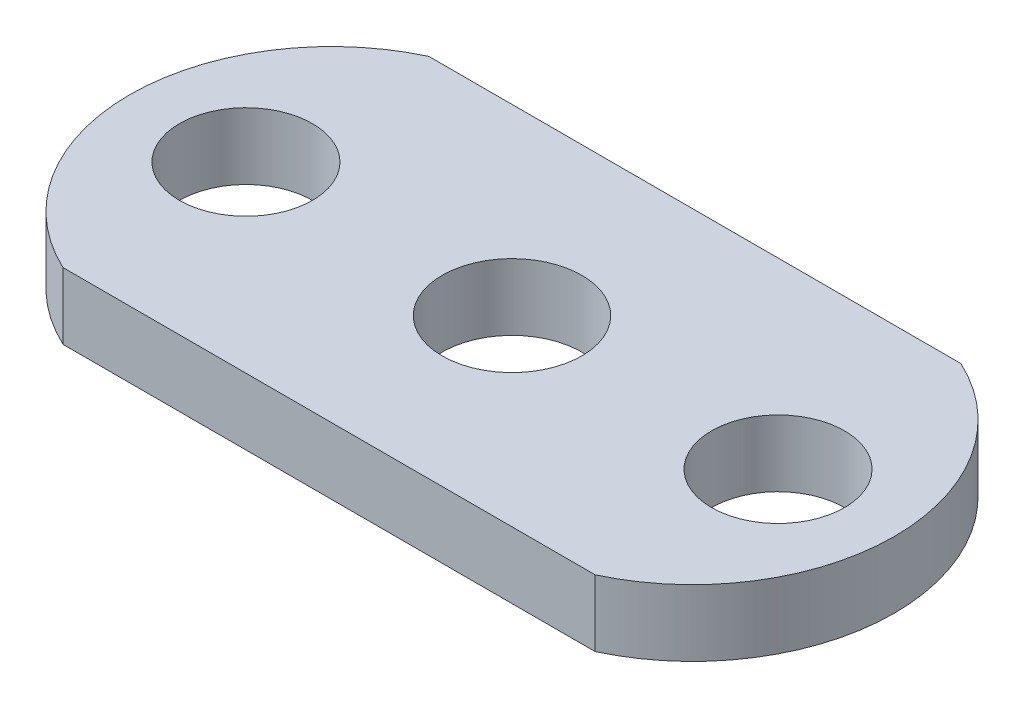
ISO-10303-21;
HEADER;
FILE_DESCRIPTION(('STEP AP214'),'2;1');
FILE_NAME('part.step','',(''),(''),'','','');
FILE_SCHEMA(('AUTOMOTIVE_DESIGN { 1 0 10303 214 1 1 1 1 }'));
ENDSEC;
DATA;
#1=APPLICATION_CONTEXT('core data for automotive mechanical design processes');
#2=APPLICATION_PROTOCOL_DEFINITION('international standard','automotive_design',2000,#1);
#3=PRODUCT_CONTEXT('',#1,'mechanical');
#4=PRODUCT('Part','Part','',(#3));
#5=PRODUCT_RELATED_PRODUCT_CATEGORY('part','',(#4));
#6=PRODUCT_DEFINITION_FORMATION('','',#4);
#7=PRODUCT_DEFINITION_CONTEXT('part definition',#1,'design');
#8=PRODUCT_DEFINITION('design','',#6,#7);
#9=PRODUCT_DEFINITION_SHAPE('','',#8);
#10=(LENGTH_UNIT() NAMED_UNIT(*) SI_UNIT(.MILLI.,.METRE.));
#11=(NAMED_UNIT(*) PLANE_ANGLE_UNIT() SI_UNIT($,.RADIAN.));
#12=(NAMED_UNIT(*) SI_UNIT($,.STERADIAN.) SOLID_ANGLE_UNIT());
#13=UNCERTAINTY_MEASURE_WITH_UNIT(LENGTH_MEASURE(1.E-05),#10,'distance_accuracy_value','');
#14=(GEOMETRIC_REPRESENTATION_CONTEXT(3) GLOBAL_UNCERTAINTY_ASSIGNED_CONTEXT((#13)) GLOBAL_UNIT_ASSIGNED_CONTEXT((#10,
#11,#12)) REPRESENTATION_CONTEXT('',''));
#15=CARTESIAN_POINT('',(0.,0.,0.));
#16=DIRECTION('',(0.,0.,1.));
#17=DIRECTION('',(1.,0.,0.));
#18=AXIS2_PLACEMENT_3D('',#15,#16,#17);
#19=CARTESIAN_POINT('',(5.42857142857143,2.,0.));
#20=DIRECTION('',(0.,-1.,0.));
#21=DIRECTION('',(0.,0.,-1.));
#22=AXIS2_PLACEMENT_3D('',#19,#20,#21);
#23=PLANE('',#22);
#24=CARTESIAN_POINT('',(5.42857142857143,2.,0.));
#25=DIRECTION('',(0.,1.,0.));
#26=DIRECTION('',(0.,0.,-1.));
#27=AXIS2_PLACEMENT_3D('',#24,#25,#26);
#28=CIRCLE('',#27,6.07142857142857);
#29=CARTESIAN_POINT('',(8.,2.,5.5));
#30=VERTEX_POINT('',#29);
#31=CARTESIAN_POINT('',(8.,2.,-5.5));
#32=VERTEX_POINT('',#31);
#33=EDGE_CURVE('E87',#30,#32,#28,.T.);
#34=ORIENTED_EDGE('',*,*,#33,.T.);
#35=DIRECTION('',(-1.,0.,0.));
#36=VECTOR('',#35,1.);
#37=CARTESIAN_POINT('',(-8.,2.,-5.5));
#38=LINE('',#37,#36);
#39=CARTESIAN_POINT('',(-8.,2.,-5.5));
#40=VERTEX_POINT('',#39);
#41=EDGE_CURVE('E85',#32,#40,#38,.T.);
#42=ORIENTED_EDGE('',*,*,#41,.T.);
#43=CARTESIAN_POINT('',(-5.42857142857143,2.,0.));
#44=DIRECTION('',(0.,1.,0.));
#45=DIRECTION('',(0.,0.,-1.));
#46=AXIS2_PLACEMENT_3D('',#43,#44,#45);
#47=CIRCLE('',#46,6.07142857142857);
#48=CARTESIAN_POINT('',(-8.,2.,5.5));
#49=VERTEX_POINT('',#48);
#50=EDGE_CURVE('E81',#40,#49,#47,.T.);
#51=ORIENTED_EDGE('',*,*,#50,.T.);
#52=DIRECTION('',(1.,0.,0.));
#53=VECTOR('',#52,1.);
#54=CARTESIAN_POINT('',(-8.,2.,5.5));
#55=LINE('',#54,#53);
#56=EDGE_CURVE('E55',#49,#30,#55,.T.);
#57=ORIENTED_EDGE('',*,*,#56,.T.);
#58=EDGE_LOOP('',(#34,#42,#51,#57));
#59=FACE_BOUND('',#58,.T.);
#60=CARTESIAN_POINT('',(8.,2.,0.));
#61=DIRECTION('',(0.,1.,0.));
#62=DIRECTION('',(0.,0.,1.));
#63=AXIS2_PLACEMENT_3D('',#60,#61,#62);
#64=CIRCLE('',#63,2.);
#65=CARTESIAN_POINT('',(8.,2.,2.));
#66=VERTEX_POINT('',#65);
#67=EDGE_CURVE('E105',#66,#66,#64,.T.);
#68=ORIENTED_EDGE('',*,*,#67,.F.);
#69=EDGE_LOOP('',(#68));
#70=FACE_BOUND('',#69,.T.);
#71=CARTESIAN_POINT('',(0.,2.,0.));
#72=DIRECTION('',(0.,1.,0.));
#73=DIRECTION('',(0.,0.,1.));
#74=AXIS2_PLACEMENT_3D('',#71,#72,#73);
#75=CIRCLE('',#74,2.1);
#76=CARTESIAN_POINT('',(0.,2.,2.1));
#77=VERTEX_POINT('',#76);
#78=EDGE_CURVE('E120',#77,#77,#75,.T.);
#79=ORIENTED_EDGE('',*,*,#78,.F.);
#80=EDGE_LOOP('',(#79));
#81=FACE_BOUND('',#80,.T.);
#82=CARTESIAN_POINT('',(-8.,2.,0.));
#83=DIRECTION('',(0.,1.,0.));
#84=DIRECTION('',(0.,0.,1.));
#85=AXIS2_PLACEMENT_3D('',#82,#83,#84);
#86=CIRCLE('',#85,2.);
#87=CARTESIAN_POINT('',(-8.,2.,2.));
#88=VERTEX_POINT('',#87);
#89=EDGE_CURVE('E123',#88,#88,#86,.T.);
#90=ORIENTED_EDGE('',*,*,#89,.F.);
#91=EDGE_LOOP('',(#90));
#92=FACE_BOUND('',#91,.T.);
#93=ADVANCED_FACE('F34',(#59,#70,#81,#92),#23,.F.);
#94=CARTESIAN_POINT('',(5.42857142857143,0.,0.));
#95=DIRECTION('',(0.,-1.,0.));
#96=DIRECTION('',(0.,0.,-1.));
#97=AXIS2_PLACEMENT_3D('',#94,#95,#96);
#98=PLANE('',#97);
#99=CARTESIAN_POINT('',(0.,0.,0.));
#100=DIRECTION('',(0.,1.,0.));
#101=DIRECTION('',(0.,0.,1.));
#102=AXIS2_PLACEMENT_3D('',#99,#100,#101);
#103=CIRCLE('',#102,2.1);
#104=CARTESIAN_POINT('',(0.,0.,2.1));
#105=VERTEX_POINT('',#104);
#106=EDGE_CURVE('E118',#105,#105,#103,.T.);
#107=ORIENTED_EDGE('',*,*,#106,.T.);
#108=EDGE_LOOP('',(#107));
#109=FACE_BOUND('',#108,.T.);
#110=CARTESIAN_POINT('',(5.42857142857143,0.,0.));
#111=DIRECTION('',(0.,1.,0.));
#112=DIRECTION('',(0.,0.,-1.));
#113=AXIS2_PLACEMENT_3D('',#110,#111,#112);
#114=CIRCLE('',#113,6.07142857142857);
#115=CARTESIAN_POINT('',(8.,0.,5.5));
#116=VERTEX_POINT('',#115);
#117=CARTESIAN_POINT('',(8.,0.,-5.5));
#118=VERTEX_POINT('',#117);
#119=EDGE_CURVE('E97',#116,#118,#114,.T.);
#120=ORIENTED_EDGE('',*,*,#119,.F.);
#121=DIRECTION('',(1.,0.,0.));
#122=VECTOR('',#121,1.);
#123=CARTESIAN_POINT('',(-8.,0.,5.5));
#124=LINE('',#123,#122);
#125=CARTESIAN_POINT('',(-8.,0.,5.5));
#126=VERTEX_POINT('',#125);
#127=EDGE_CURVE('E73',#126,#116,#124,.T.);
#128=ORIENTED_EDGE('',*,*,#127,.F.);
#129=CARTESIAN_POINT('',(-5.42857142857143,0.,0.));
#130=DIRECTION('',(0.,1.,0.));
#131=DIRECTION('',(0.,0.,-1.));
#132=AXIS2_PLACEMENT_3D('',#129,#130,#131);
#133=CIRCLE('',#132,6.07142857142857);
#134=CARTESIAN_POINT('',(-8.,0.,-5.5));
#135=VERTEX_POINT('',#134);
#136=EDGE_CURVE('E69',#135,#126,#133,.T.);
#137=ORIENTED_EDGE('',*,*,#136,.F.);
#138=DIRECTION('',(-1.,0.,0.));
#139=VECTOR('',#138,1.);
#140=CARTESIAN_POINT('',(-8.,0.,-5.5));
#141=LINE('',#140,#139);
#142=EDGE_CURVE('E93',#118,#135,#141,.T.);
#143=ORIENTED_EDGE('',*,*,#142,.F.);
#144=EDGE_LOOP('',(#120,#128,#137,#143));
#145=FACE_BOUND('',#144,.T.);
#146=CARTESIAN_POINT('',(8.,0.,0.));
#147=DIRECTION('',(0.,1.,0.));
#148=DIRECTION('',(0.,0.,1.));
#149=AXIS2_PLACEMENT_3D('',#146,#147,#148);
#150=CIRCLE('',#149,2.);
#151=CARTESIAN_POINT('',(8.,0.,2.));
#152=VERTEX_POINT('',#151);
#153=EDGE_CURVE('E111',#152,#152,#150,.T.);
#154=ORIENTED_EDGE('',*,*,#153,.T.);
#155=EDGE_LOOP('',(#154));
#156=FACE_BOUND('',#155,.T.);
#157=CARTESIAN_POINT('',(-8.,0.,0.));
#158=DIRECTION('',(0.,1.,0.));
#159=DIRECTION('',(0.,0.,1.));
#160=AXIS2_PLACEMENT_3D('',#157,#158,#159);
#161=CIRCLE('',#160,2.);
#162=CARTESIAN_POINT('',(-8.,0.,2.));
#163=VERTEX_POINT('',#162);
#164=EDGE_CURVE('E127',#163,#163,#161,.T.);
#165=ORIENTED_EDGE('',*,*,#164,.T.);
#166=EDGE_LOOP('',(#165));
#167=FACE_BOUND('',#166,.T.);
#168=ADVANCED_FACE('F109',(#109,#145,#156,#167),#98,.T.);
#169=CARTESIAN_POINT('',(5.42857142857143,2.,0.));
#170=DIRECTION('',(0.,-1.,0.));
#171=DIRECTION('',(0.,0.,-1.));
#172=AXIS2_PLACEMENT_3D('',#169,#170,#171);
#173=CYLINDRICAL_SURFACE('',#172,6.07142857142857);
#174=ORIENTED_EDGE('',*,*,#119,.T.);
#175=DIRECTION('',(0.,-1.,0.));
#176=VECTOR('',#175,1.);
#177=CARTESIAN_POINT('',(8.,2.,-5.5));
#178=LINE('',#177,#176);
#179=EDGE_CURVE('E11',#32,#118,#178,.T.);
#180=ORIENTED_EDGE('',*,*,#179,.F.);
#181=ORIENTED_EDGE('',*,*,#33,.F.);
#182=DIRECTION('',(0.,-1.,0.));
#183=VECTOR('',#182,1.);
#184=CARTESIAN_POINT('',(8.,2.,5.5));
#185=LINE('',#184,#183);
#186=EDGE_CURVE('E92',#30,#116,#185,.T.);
#187=ORIENTED_EDGE('',*,*,#186,.T.);
#188=EDGE_LOOP('',(#174,#180,#181,#187));
#189=FACE_BOUND('',#188,.T.);
#190=ADVANCED_FACE('F40',(#189),#173,.T.);
#191=CARTESIAN_POINT('',(-8.,2.,-5.5));
#192=DIRECTION('',(0.,0.,1.));
#193=DIRECTION('',(1.,0.,0.));
#194=AXIS2_PLACEMENT_3D('',#191,#192,#193);
#195=PLANE('',#194);
#196=ORIENTED_EDGE('',*,*,#142,.T.);
#197=DIRECTION('',(0.,-1.,0.));
#198=VECTOR('',#197,1.);
#199=CARTESIAN_POINT('',(-8.,2.,-5.5));
#200=LINE('',#199,#198);
#201=EDGE_CURVE('E42',#40,#135,#200,.T.);
#202=ORIENTED_EDGE('',*,*,#201,.F.);
#203=ORIENTED_EDGE('',*,*,#41,.F.);
#204=ORIENTED_EDGE('',*,*,#179,.T.);
#205=EDGE_LOOP('',(#196,#202,#203,#204));
#206=FACE_BOUND('',#205,.T.);
#207=ADVANCED_FACE('F89',(#206),#195,.F.);
#208=CARTESIAN_POINT('',(-5.42857142857143,2.,0.));
#209=DIRECTION('',(0.,-1.,0.));
#210=DIRECTION('',(0.,0.,-1.));
#211=AXIS2_PLACEMENT_3D('',#208,#209,#210);
#212=CYLINDRICAL_SURFACE('',#211,6.07142857142857);
#213=ORIENTED_EDGE('',*,*,#136,.T.);
#214=DIRECTION('',(0.,-1.,0.));
#215=VECTOR('',#214,1.);
#216=CARTESIAN_POINT('',(-8.,2.,5.5));
#217=LINE('',#216,#215);
#218=EDGE_CURVE('E95',#49,#126,#217,.T.);
#219=ORIENTED_EDGE('',*,*,#218,.F.);
#220=ORIENTED_EDGE('',*,*,#50,.F.);
#221=ORIENTED_EDGE('',*,*,#201,.T.);
#222=EDGE_LOOP('',(#213,#219,#220,#221));
#223=FACE_BOUND('',#222,.T.);
#224=ADVANCED_FACE('F91',(#223),#212,.T.);
#225=CARTESIAN_POINT('',(-8.,2.,5.5));
#226=DIRECTION('',(0.,0.,-1.));
#227=DIRECTION('',(-1.,0.,0.));
#228=AXIS2_PLACEMENT_3D('',#225,#226,#227);
#229=PLANE('',#228);
#230=ORIENTED_EDGE('',*,*,#127,.T.);
#231=ORIENTED_EDGE('',*,*,#186,.F.);
#232=ORIENTED_EDGE('',*,*,#56,.F.);
#233=ORIENTED_EDGE('',*,*,#218,.T.);
#234=EDGE_LOOP('',(#230,#231,#232,#233));
#235=FACE_BOUND('',#234,.T.);
#236=ADVANCED_FACE('F110',(#235),#229,.F.);
#237=CARTESIAN_POINT('',(8.,2.,0.));
#238=DIRECTION('',(0.,-1.,0.));
#239=DIRECTION('',(0.,0.,-1.));
#240=AXIS2_PLACEMENT_3D('',#237,#238,#239);
#241=CYLINDRICAL_SURFACE('',#240,2.);
#242=ORIENTED_EDGE('',*,*,#67,.T.);
#243=EDGE_LOOP('',(#242));
#244=FACE_BOUND('',#243,.T.);
#245=ORIENTED_EDGE('',*,*,#153,.F.);
#246=EDGE_LOOP('',(#245));
#247=FACE_BOUND('',#246,.T.);
#248=ADVANCED_FACE('F141',(#244,#247),#241,.F.);
#249=CARTESIAN_POINT('',(0.,2.,0.));
#250=DIRECTION('',(0.,-1.,0.));
#251=DIRECTION('',(0.,0.,-1.));
#252=AXIS2_PLACEMENT_3D('',#249,#250,#251);
#253=CYLINDRICAL_SURFACE('',#252,2.1);
#254=ORIENTED_EDGE('',*,*,#78,.T.);
#255=EDGE_LOOP('',(#254));
#256=FACE_BOUND('',#255,.T.);
#257=ORIENTED_EDGE('',*,*,#106,.F.);
#258=EDGE_LOOP('',(#257));
#259=FACE_BOUND('',#258,.T.);
#260=ADVANCED_FACE('F178',(#256,#259),#253,.F.);
#261=CARTESIAN_POINT('',(-8.,2.,0.));
#262=DIRECTION('',(0.,-1.,0.));
#263=DIRECTION('',(0.,0.,-1.));
#264=AXIS2_PLACEMENT_3D('',#261,#262,#263);
#265=CYLINDRICAL_SURFACE('',#264,2.);
#266=ORIENTED_EDGE('',*,*,#89,.T.);
#267=EDGE_LOOP('',(#266));
#268=FACE_BOUND('',#267,.T.);
#269=ORIENTED_EDGE('',*,*,#164,.F.);
#270=EDGE_LOOP('',(#269));
#271=FACE_BOUND('',#270,.T.);
#272=ADVANCED_FACE('F135',(#268,#271),#265,.F.);
#273=CLOSED_SHELL('',(#93,#168,#190,#207,#224,#236,#248,#260,#272));
#274=MANIFOLD_SOLID_BREP('B2',#273);
#275=ADVANCED_BREP_SHAPE_REPRESENTATION('',(#18,#274),#14);
#276=SHAPE_DEFINITION_REPRESENTATION(#9,#275);
ENDSEC;
END-ISO-10303-21;
